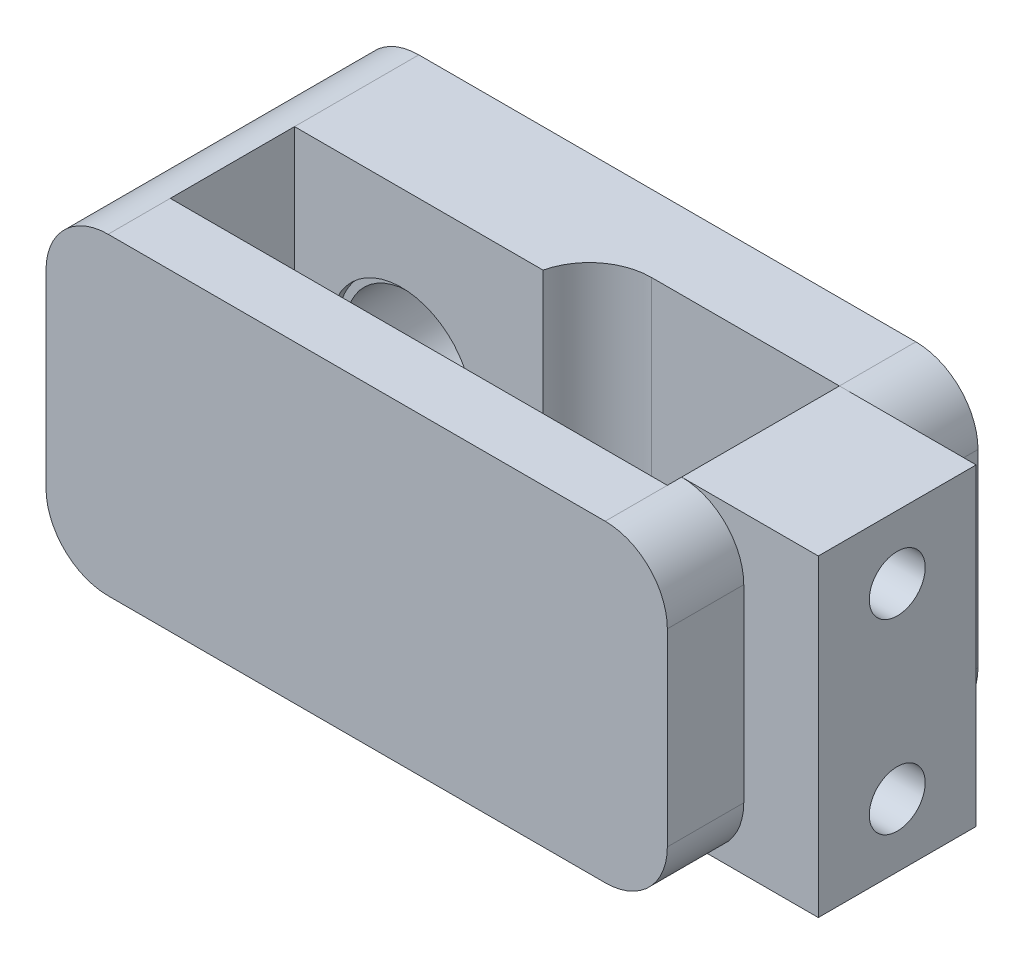
ISO-10303-21;
HEADER;
FILE_DESCRIPTION(('STEP AP214'),'2;1');
FILE_NAME('part.step','',(''),(''),'','','');
FILE_SCHEMA(('AUTOMOTIVE_DESIGN { 1 0 10303 214 1 1 1 1 }'));
ENDSEC;
DATA;
#1=APPLICATION_CONTEXT('core data for automotive mechanical design processes');
#2=APPLICATION_PROTOCOL_DEFINITION('international standard','automotive_design',2000,#1);
#3=PRODUCT_CONTEXT('',#1,'mechanical');
#4=PRODUCT('Part','Part','',(#3));
#5=PRODUCT_RELATED_PRODUCT_CATEGORY('part','',(#4));
#6=PRODUCT_DEFINITION_FORMATION('','',#4);
#7=PRODUCT_DEFINITION_CONTEXT('part definition',#1,'design');
#8=PRODUCT_DEFINITION('design','',#6,#7);
#9=PRODUCT_DEFINITION_SHAPE('','',#8);
#10=(LENGTH_UNIT() NAMED_UNIT(*) SI_UNIT(.MILLI.,.METRE.));
#11=(NAMED_UNIT(*) PLANE_ANGLE_UNIT() SI_UNIT($,.RADIAN.));
#12=(NAMED_UNIT(*) SI_UNIT($,.STERADIAN.) SOLID_ANGLE_UNIT());
#13=UNCERTAINTY_MEASURE_WITH_UNIT(LENGTH_MEASURE(1.E-05),#10,'distance_accuracy_value','');
#14=(GEOMETRIC_REPRESENTATION_CONTEXT(3) GLOBAL_UNCERTAINTY_ASSIGNED_CONTEXT((#13)) GLOBAL_UNIT_ASSIGNED_CONTEXT((#10,
#11,#12)) REPRESENTATION_CONTEXT('',''));
#15=CARTESIAN_POINT('',(0.,0.,0.));
#16=DIRECTION('',(0.,0.,1.));
#17=DIRECTION('',(1.,0.,0.));
#18=AXIS2_PLACEMENT_3D('',#15,#16,#17);
#19=CARTESIAN_POINT('',(0.,25.2,0.));
#20=DIRECTION('',(0.,1.,0.));
#21=DIRECTION('',(0.,0.,1.));
#22=AXIS2_PLACEMENT_3D('',#19,#20,#21);
#23=PLANE('',#22);
#24=DIRECTION('',(-1.,0.,0.));
#25=VECTOR('',#24,1.);
#26=CARTESIAN_POINT('',(20.,25.2,-6.35));
#27=LINE('',#26,#25);
#28=CARTESIAN_POINT('',(20.,25.2,-6.35));
#29=VERTEX_POINT('',#28);
#30=CARTESIAN_POINT('',(4.86595314404074,25.2,-6.35));
#31=VERTEX_POINT('',#30);
#32=EDGE_CURVE('E227',#29,#31,#27,.T.);
#33=ORIENTED_EDGE('',*,*,#32,.F.);
#34=DIRECTION('',(0.,0.,-1.));
#35=VECTOR('',#34,1.);
#36=CARTESIAN_POINT('',(20.,25.2,-12.5));
#37=LINE('',#36,#35);
#38=CARTESIAN_POINT('',(20.,25.2,-12.5));
#39=VERTEX_POINT('',#38);
#40=EDGE_CURVE('E325',#29,#39,#37,.T.);
#41=ORIENTED_EDGE('',*,*,#40,.T.);
#42=DIRECTION('',(-1.,0.,0.));
#43=VECTOR('',#42,1.);
#44=CARTESIAN_POINT('',(-25.,25.2,-12.5));
#45=LINE('',#44,#43);
#46=CARTESIAN_POINT('',(-20.,25.2,-12.5));
#47=VERTEX_POINT('',#46);
#48=EDGE_CURVE('E282',#39,#47,#45,.T.);
#49=ORIENTED_EDGE('',*,*,#48,.T.);
#50=DIRECTION('',(0.,0.,1.));
#51=VECTOR('',#50,1.);
#52=CARTESIAN_POINT('',(-20.,25.2,12.5));
#53=LINE('',#52,#51);
#54=CARTESIAN_POINT('',(-20.,25.2,-2.5));
#55=VERTEX_POINT('',#54);
#56=EDGE_CURVE('E320',#47,#55,#53,.T.);
#57=ORIENTED_EDGE('',*,*,#56,.T.);
#58=DIRECTION('',(-1.,0.,0.));
#59=VECTOR('',#58,1.);
#60=CARTESIAN_POINT('',(-20.,25.2,-2.5));
#61=LINE('',#60,#59);
#62=CARTESIAN_POINT('',(0.,25.2,-2.5));
#63=VERTEX_POINT('',#62);
#64=EDGE_CURVE('E250',#63,#55,#61,.T.);
#65=ORIENTED_EDGE('',*,*,#64,.F.);
#66=CARTESIAN_POINT('',(4.86595314404074,25.2,-1.35));
#67=DIRECTION('',(0.,1.,0.));
#68=DIRECTION('',(0.,0.,1.));
#69=AXIS2_PLACEMENT_3D('',#66,#67,#68);
#70=CIRCLE('',#69,5.);
#71=EDGE_CURVE('E47',#63,#31,#70,.F.);
#72=ORIENTED_EDGE('',*,*,#71,.T.);
#73=EDGE_LOOP('',(#33,#41,#49,#57,#65,#72));
#74=FACE_BOUND('',#73,.T.);
#75=ADVANCED_FACE('F39',(#74),#23,.T.);
#76=DIRECTION('',(1.,0.,0.));
#77=VECTOR('',#76,1.);
#78=CARTESIAN_POINT('',(-25.,25.2,12.5));
#79=LINE('',#78,#77);
#80=CARTESIAN_POINT('',(-20.,25.2,12.5));
#81=VERTEX_POINT('',#80);
#82=CARTESIAN_POINT('',(20.,25.2,12.5));
#83=VERTEX_POINT('',#82);
#84=EDGE_CURVE('E285',#81,#83,#79,.T.);
#85=ORIENTED_EDGE('',*,*,#84,.T.);
#86=DIRECTION('',(0.,0.,-1.));
#87=VECTOR('',#86,1.);
#88=CARTESIAN_POINT('',(20.,25.2,6.35));
#89=LINE('',#88,#87);
#90=CARTESIAN_POINT('',(20.,25.2,7.5));
#91=VERTEX_POINT('',#90);
#92=EDGE_CURVE('E322',#83,#91,#89,.T.);
#93=ORIENTED_EDGE('',*,*,#92,.T.);
#94=DIRECTION('',(1.,0.,0.));
#95=VECTOR('',#94,1.);
#96=CARTESIAN_POINT('',(-20.,25.2,7.5));
#97=LINE('',#96,#95);
#98=CARTESIAN_POINT('',(-20.,25.2,7.5));
#99=VERTEX_POINT('',#98);
#100=EDGE_CURVE('E278',#99,#91,#97,.T.);
#101=ORIENTED_EDGE('',*,*,#100,.F.);
#102=DIRECTION('',(0.,0.,1.));
#103=VECTOR('',#102,1.);
#104=CARTESIAN_POINT('',(-20.,25.2,12.5));
#105=LINE('',#104,#103);
#106=EDGE_CURVE('E198',#99,#81,#105,.T.);
#107=ORIENTED_EDGE('',*,*,#106,.T.);
#108=EDGE_LOOP('',(#85,#93,#101,#107));
#109=FACE_BOUND('',#108,.T.);
#110=ADVANCED_FACE('F378',(#109),#23,.T.);
#111=CARTESIAN_POINT('',(0.,0.,0.));
#112=DIRECTION('',(0.,1.,0.));
#113=DIRECTION('',(0.,0.,1.));
#114=AXIS2_PLACEMENT_3D('',#111,#112,#113);
#115=PLANE('',#114);
#116=DIRECTION('',(-1.,0.,0.));
#117=VECTOR('',#116,1.);
#118=CARTESIAN_POINT('',(-25.,0.,-12.5));
#119=LINE('',#118,#117);
#120=CARTESIAN_POINT('',(20.,0.,-12.5));
#121=VERTEX_POINT('',#120);
#122=CARTESIAN_POINT('',(-20.,0.,-12.5));
#123=VERTEX_POINT('',#122);
#124=EDGE_CURVE('E196',#121,#123,#119,.T.);
#125=ORIENTED_EDGE('',*,*,#124,.F.);
#126=DIRECTION('',(0.,0.,-1.));
#127=VECTOR('',#126,1.);
#128=CARTESIAN_POINT('',(20.,0.,0.));
#129=LINE('',#128,#127);
#130=CARTESIAN_POINT('',(20.,0.,-6.35));
#131=VERTEX_POINT('',#130);
#132=EDGE_CURVE('E190',#121,#131,#129,.F.);
#133=ORIENTED_EDGE('',*,*,#132,.T.);
#134=DIRECTION('',(-1.,0.,0.));
#135=VECTOR('',#134,1.);
#136=CARTESIAN_POINT('',(20.,0.,-6.35));
#137=LINE('',#136,#135);
#138=CARTESIAN_POINT('',(4.86595314404074,0.,-6.35));
#139=VERTEX_POINT('',#138);
#140=EDGE_CURVE('E193',#131,#139,#137,.T.);
#141=ORIENTED_EDGE('',*,*,#140,.T.);
#142=CARTESIAN_POINT('',(4.86595314404074,0.,-1.35));
#143=DIRECTION('',(0.,1.,0.));
#144=DIRECTION('',(0.,0.,1.));
#145=AXIS2_PLACEMENT_3D('',#142,#143,#144);
#146=CIRCLE('',#145,5.);
#147=CARTESIAN_POINT('',(0.,0.,-2.5));
#148=VERTEX_POINT('',#147);
#149=EDGE_CURVE('E11',#139,#148,#146,.T.);
#150=ORIENTED_EDGE('',*,*,#149,.T.);
#151=DIRECTION('',(-1.,0.,0.));
#152=VECTOR('',#151,1.);
#153=CARTESIAN_POINT('',(-20.,0.,-2.5));
#154=LINE('',#153,#152);
#155=CARTESIAN_POINT('',(-20.,0.,-2.5));
#156=VERTEX_POINT('',#155);
#157=EDGE_CURVE('E257',#148,#156,#154,.T.);
#158=ORIENTED_EDGE('',*,*,#157,.T.);
#159=DIRECTION('',(0.,0.,1.));
#160=VECTOR('',#159,1.);
#161=CARTESIAN_POINT('',(-20.,0.,0.));
#162=LINE('',#161,#160);
#163=EDGE_CURVE('E314',#156,#123,#162,.F.);
#164=ORIENTED_EDGE('',*,*,#163,.T.);
#165=EDGE_LOOP('',(#125,#133,#141,#150,#158,#164));
#166=FACE_BOUND('',#165,.T.);
#167=ADVANCED_FACE('F191',(#166),#115,.F.);
#168=DIRECTION('',(0.,0.,-1.));
#169=VECTOR('',#168,1.);
#170=CARTESIAN_POINT('',(20.,0.,-2.5));
#171=LINE('',#170,#169);
#172=CARTESIAN_POINT('',(20.,0.,6.35));
#173=VERTEX_POINT('',#172);
#174=EDGE_CURVE('E202',#173,#131,#171,.T.);
#175=ORIENTED_EDGE('',*,*,#174,.T.);
#176=DIRECTION('',(-1.,0.,0.));
#177=VECTOR('',#176,1.);
#178=CARTESIAN_POINT('',(31.,0.,-6.35));
#179=LINE('',#178,#177);
#180=CARTESIAN_POINT('',(31.,0.,-6.35));
#181=VERTEX_POINT('',#180);
#182=EDGE_CURVE('E172',#181,#131,#179,.T.);
#183=ORIENTED_EDGE('',*,*,#182,.F.);
#184=DIRECTION('',(0.,0.,-1.));
#185=VECTOR('',#184,1.);
#186=CARTESIAN_POINT('',(31.,0.,6.35));
#187=LINE('',#186,#185);
#188=CARTESIAN_POINT('',(31.,0.,6.35));
#189=VERTEX_POINT('',#188);
#190=EDGE_CURVE('E395',#189,#181,#187,.T.);
#191=ORIENTED_EDGE('',*,*,#190,.F.);
#192=DIRECTION('',(-1.,0.,0.));
#193=VECTOR('',#192,1.);
#194=CARTESIAN_POINT('',(31.,0.,6.35));
#195=LINE('',#194,#193);
#196=EDGE_CURVE('E183',#189,#173,#195,.T.);
#197=ORIENTED_EDGE('',*,*,#196,.T.);
#198=EDGE_LOOP('',(#175,#183,#191,#197));
#199=FACE_BOUND('',#198,.T.);
#200=ADVANCED_FACE('F204',(#199),#115,.F.);
#201=CARTESIAN_POINT('',(25.,25.2,-12.5));
#202=DIRECTION('',(-1.,0.,0.));
#203=DIRECTION('',(0.,0.,1.));
#204=AXIS2_PLACEMENT_3D('',#201,#202,#203);
#205=PLANE('',#204);
#206=DIRECTION('',(0.,-1.,0.));
#207=VECTOR('',#206,1.);
#208=CARTESIAN_POINT('',(25.,25.2,12.5));
#209=LINE('',#208,#207);
#210=CARTESIAN_POINT('',(25.,20.2,12.5));
#211=VERTEX_POINT('',#210);
#212=CARTESIAN_POINT('',(25.,5.,12.5));
#213=VERTEX_POINT('',#212);
#214=EDGE_CURVE('E289',#211,#213,#209,.T.);
#215=ORIENTED_EDGE('',*,*,#214,.T.);
#216=DIRECTION('',(0.,0.,-1.));
#217=VECTOR('',#216,1.);
#218=CARTESIAN_POINT('',(25.,5.,-12.5));
#219=LINE('',#218,#217);
#220=CARTESIAN_POINT('',(25.,5.,6.35));
#221=VERTEX_POINT('',#220);
#222=EDGE_CURVE('E329',#213,#221,#219,.T.);
#223=ORIENTED_EDGE('',*,*,#222,.T.);
#224=DIRECTION('',(0.,-1.,0.));
#225=VECTOR('',#224,1.);
#226=CARTESIAN_POINT('',(25.,25.2,6.35));
#227=LINE('',#226,#225);
#228=CARTESIAN_POINT('',(25.,20.2,6.35));
#229=VERTEX_POINT('',#228);
#230=EDGE_CURVE('E372',#229,#221,#227,.T.);
#231=ORIENTED_EDGE('',*,*,#230,.F.);
#232=DIRECTION('',(0.,0.,-1.));
#233=VECTOR('',#232,1.);
#234=CARTESIAN_POINT('',(25.,20.2,12.5));
#235=LINE('',#234,#233);
#236=EDGE_CURVE('E327',#229,#211,#235,.F.);
#237=ORIENTED_EDGE('',*,*,#236,.T.);
#238=EDGE_LOOP('',(#215,#223,#231,#237));
#239=FACE_BOUND('',#238,.T.);
#240=ADVANCED_FACE('F368',(#239),#205,.F.);
#241=DIRECTION('',(0.,1.,0.));
#242=VECTOR('',#241,1.);
#243=CARTESIAN_POINT('',(25.,25.2,-6.35));
#244=LINE('',#243,#242);
#245=CARTESIAN_POINT('',(25.,5.,-6.35));
#246=VERTEX_POINT('',#245);
#247=CARTESIAN_POINT('',(25.,20.2,-6.35));
#248=VERTEX_POINT('',#247);
#249=EDGE_CURVE('E390',#246,#248,#244,.T.);
#250=ORIENTED_EDGE('',*,*,#249,.F.);
#251=DIRECTION('',(0.,0.,-1.));
#252=VECTOR('',#251,1.);
#253=CARTESIAN_POINT('',(25.,5.,-12.5));
#254=LINE('',#253,#252);
#255=CARTESIAN_POINT('',(25.,5.,-12.5));
#256=VERTEX_POINT('',#255);
#257=EDGE_CURVE('E232',#246,#256,#254,.T.);
#258=ORIENTED_EDGE('',*,*,#257,.T.);
#259=DIRECTION('',(0.,-1.,0.));
#260=VECTOR('',#259,1.);
#261=CARTESIAN_POINT('',(25.,25.2,-12.5));
#262=LINE('',#261,#260);
#263=CARTESIAN_POINT('',(25.,20.2,-12.5));
#264=VERTEX_POINT('',#263);
#265=EDGE_CURVE('E300',#264,#256,#262,.T.);
#266=ORIENTED_EDGE('',*,*,#265,.F.);
#267=DIRECTION('',(0.,0.,-1.));
#268=VECTOR('',#267,1.);
#269=CARTESIAN_POINT('',(25.,20.2,-6.35));
#270=LINE('',#269,#268);
#271=EDGE_CURVE('E303',#264,#248,#270,.F.);
#272=ORIENTED_EDGE('',*,*,#271,.T.);
#273=EDGE_LOOP('',(#250,#258,#266,#272));
#274=FACE_BOUND('',#273,.T.);
#275=ADVANCED_FACE('F388',(#274),#205,.F.);
#276=DIRECTION('',(-1.,0.,0.));
#277=VECTOR('',#276,1.);
#278=CARTESIAN_POINT('',(31.,25.2,-6.35));
#279=LINE('',#278,#277);
#280=CARTESIAN_POINT('',(31.,25.2,-6.35));
#281=VERTEX_POINT('',#280);
#282=EDGE_CURVE('E184',#281,#29,#279,.T.);
#283=ORIENTED_EDGE('',*,*,#282,.T.);
#284=DIRECTION('',(0.,0.,-1.));
#285=VECTOR('',#284,1.);
#286=CARTESIAN_POINT('',(20.,25.2,-2.5));
#287=LINE('',#286,#285);
#288=CARTESIAN_POINT('',(20.,25.2,6.35));
#289=VERTEX_POINT('',#288);
#290=EDGE_CURVE('E218',#289,#29,#287,.T.);
#291=ORIENTED_EDGE('',*,*,#290,.F.);
#292=DIRECTION('',(-1.,0.,0.));
#293=VECTOR('',#292,1.);
#294=CARTESIAN_POINT('',(31.,25.2,6.35));
#295=LINE('',#294,#293);
#296=CARTESIAN_POINT('',(31.,25.2,6.35));
#297=VERTEX_POINT('',#296);
#298=EDGE_CURVE('E401',#297,#289,#295,.T.);
#299=ORIENTED_EDGE('',*,*,#298,.F.);
#300=DIRECTION('',(0.,0.,1.));
#301=VECTOR('',#300,1.);
#302=CARTESIAN_POINT('',(31.,25.2,6.35));
#303=LINE('',#302,#301);
#304=EDGE_CURVE('E403',#281,#297,#303,.T.);
#305=ORIENTED_EDGE('',*,*,#304,.F.);
#306=EDGE_LOOP('',(#283,#291,#299,#305));
#307=FACE_BOUND('',#306,.T.);
#308=ADVANCED_FACE('F452',(#307),#23,.T.);
#309=DIRECTION('',(1.,0.,0.));
#310=VECTOR('',#309,1.);
#311=CARTESIAN_POINT('',(-20.,0.,7.5));
#312=LINE('',#311,#310);
#313=CARTESIAN_POINT('',(-20.,0.,7.5));
#314=VERTEX_POINT('',#313);
#315=CARTESIAN_POINT('',(20.,0.,7.5));
#316=VERTEX_POINT('',#315);
#317=EDGE_CURVE('E268',#314,#316,#312,.T.);
#318=ORIENTED_EDGE('',*,*,#317,.T.);
#319=DIRECTION('',(0.,0.,-1.));
#320=VECTOR('',#319,1.);
#321=CARTESIAN_POINT('',(20.,0.,0.));
#322=LINE('',#321,#320);
#323=CARTESIAN_POINT('',(20.,0.,12.5));
#324=VERTEX_POINT('',#323);
#325=EDGE_CURVE('E199',#316,#324,#322,.F.);
#326=ORIENTED_EDGE('',*,*,#325,.T.);
#327=DIRECTION('',(1.,0.,0.));
#328=VECTOR('',#327,1.);
#329=CARTESIAN_POINT('',(-25.,0.,12.5));
#330=LINE('',#329,#328);
#331=CARTESIAN_POINT('',(-20.,0.,12.5));
#332=VERTEX_POINT('',#331);
#333=EDGE_CURVE('E286',#332,#324,#330,.T.);
#334=ORIENTED_EDGE('',*,*,#333,.F.);
#335=DIRECTION('',(0.,0.,1.));
#336=VECTOR('',#335,1.);
#337=CARTESIAN_POINT('',(-20.,0.,0.));
#338=LINE('',#337,#336);
#339=EDGE_CURVE('E316',#332,#314,#338,.F.);
#340=ORIENTED_EDGE('',*,*,#339,.T.);
#341=EDGE_LOOP('',(#318,#326,#334,#340));
#342=FACE_BOUND('',#341,.T.);
#343=ADVANCED_FACE('F348',(#342),#115,.F.);
#344=CARTESIAN_POINT('',(-25.,25.2,-12.5));
#345=DIRECTION('',(0.,0.,1.));
#346=DIRECTION('',(1.,0.,0.));
#347=AXIS2_PLACEMENT_3D('',#344,#345,#346);
#348=PLANE('',#347);
#349=CARTESIAN_POINT('',(-11.4,12.6,-12.5));
#350=DIRECTION('',(0.,0.,1.));
#351=DIRECTION('',(1.,0.,0.));
#352=AXIS2_PLACEMENT_3D('',#349,#350,#351);
#353=CIRCLE('',#352,5.10000000000001);
#354=CARTESIAN_POINT('',(-6.29999999999998,12.6,-12.5));
#355=VERTEX_POINT('',#354);
#356=EDGE_CURVE('E210',#355,#355,#353,.T.);
#357=ORIENTED_EDGE('',*,*,#356,.T.);
#358=EDGE_LOOP('',(#357));
#359=FACE_BOUND('',#358,.T.);
#360=ORIENTED_EDGE('',*,*,#265,.T.);
#361=CARTESIAN_POINT('',(20.,5.,-12.5));
#362=DIRECTION('',(0.,0.,1.));
#363=DIRECTION('',(1.,0.,0.));
#364=AXIS2_PLACEMENT_3D('',#361,#362,#363);
#365=CIRCLE('',#364,5.);
#366=EDGE_CURVE('E312',#256,#121,#365,.F.);
#367=ORIENTED_EDGE('',*,*,#366,.T.);
#368=ORIENTED_EDGE('',*,*,#124,.T.);
#369=CARTESIAN_POINT('',(-20.,5.,-12.5));
#370=DIRECTION('',(0.,0.,1.));
#371=DIRECTION('',(1.,0.,0.));
#372=AXIS2_PLACEMENT_3D('',#369,#370,#371);
#373=CIRCLE('',#372,5.);
#374=CARTESIAN_POINT('',(-25.,5.,-12.5));
#375=VERTEX_POINT('',#374);
#376=EDGE_CURVE('E308',#123,#375,#373,.F.);
#377=ORIENTED_EDGE('',*,*,#376,.T.);
#378=DIRECTION('',(0.,-1.,0.));
#379=VECTOR('',#378,1.);
#380=CARTESIAN_POINT('',(-25.,25.2,-12.5));
#381=LINE('',#380,#379);
#382=CARTESIAN_POINT('',(-25.,20.2,-12.5));
#383=VERTEX_POINT('',#382);
#384=EDGE_CURVE('E297',#383,#375,#381,.T.);
#385=ORIENTED_EDGE('',*,*,#384,.F.);
#386=CARTESIAN_POINT('',(-20.,20.2,-12.5));
#387=DIRECTION('',(0.,0.,1.));
#388=DIRECTION('',(1.,0.,0.));
#389=AXIS2_PLACEMENT_3D('',#386,#387,#388);
#390=CIRCLE('',#389,5.);
#391=EDGE_CURVE('E306',#383,#47,#390,.F.);
#392=ORIENTED_EDGE('',*,*,#391,.T.);
#393=ORIENTED_EDGE('',*,*,#48,.F.);
#394=CARTESIAN_POINT('',(20.,20.2,-12.5));
#395=DIRECTION('',(0.,0.,1.));
#396=DIRECTION('',(1.,0.,0.));
#397=AXIS2_PLACEMENT_3D('',#394,#395,#396);
#398=CIRCLE('',#397,5.);
#399=EDGE_CURVE('E310',#39,#264,#398,.F.);
#400=ORIENTED_EDGE('',*,*,#399,.T.);
#401=EDGE_LOOP('',(#360,#367,#368,#377,#385,#392,#393,#400));
#402=FACE_BOUND('',#401,.T.);
#403=ADVANCED_FACE('F384',(#359,#402),#348,.F.);
#404=CARTESIAN_POINT('',(-25.,25.2,-12.5));
#405=DIRECTION('',(1.,0.,0.));
#406=DIRECTION('',(0.,0.,-1.));
#407=AXIS2_PLACEMENT_3D('',#404,#405,#406);
#408=PLANE('',#407);
#409=ORIENTED_EDGE('',*,*,#384,.T.);
#410=DIRECTION('',(0.,0.,1.));
#411=VECTOR('',#410,1.);
#412=CARTESIAN_POINT('',(-25.,5.,-12.5));
#413=LINE('',#412,#411);
#414=CARTESIAN_POINT('',(-25.,5.,12.5));
#415=VERTEX_POINT('',#414);
#416=EDGE_CURVE('E238',#375,#415,#413,.T.);
#417=ORIENTED_EDGE('',*,*,#416,.T.);
#418=DIRECTION('',(0.,-1.,0.));
#419=VECTOR('',#418,1.);
#420=CARTESIAN_POINT('',(-25.,25.2,12.5));
#421=LINE('',#420,#419);
#422=CARTESIAN_POINT('',(-25.,20.2,12.5));
#423=VERTEX_POINT('',#422);
#424=EDGE_CURVE('E295',#423,#415,#421,.T.);
#425=ORIENTED_EDGE('',*,*,#424,.F.);
#426=DIRECTION('',(0.,0.,1.));
#427=VECTOR('',#426,1.);
#428=CARTESIAN_POINT('',(-25.,20.2,-12.5));
#429=LINE('',#428,#427);
#430=EDGE_CURVE('E338',#423,#383,#429,.F.);
#431=ORIENTED_EDGE('',*,*,#430,.T.);
#432=EDGE_LOOP('',(#409,#417,#425,#431));
#433=FACE_BOUND('',#432,.T.);
#434=ADVANCED_FACE('F340',(#433),#408,.F.);
#435=CARTESIAN_POINT('',(-25.,25.2,12.5));
#436=DIRECTION('',(0.,0.,-1.));
#437=DIRECTION('',(-1.,0.,0.));
#438=AXIS2_PLACEMENT_3D('',#435,#436,#437);
#439=PLANE('',#438);
#440=ORIENTED_EDGE('',*,*,#333,.T.);
#441=CARTESIAN_POINT('',(20.,5.,12.5));
#442=DIRECTION('',(0.,0.,-1.));
#443=DIRECTION('',(-1.,0.,0.));
#444=AXIS2_PLACEMENT_3D('',#441,#442,#443);
#445=CIRCLE('',#444,5.);
#446=EDGE_CURVE('E336',#324,#213,#445,.F.);
#447=ORIENTED_EDGE('',*,*,#446,.T.);
#448=ORIENTED_EDGE('',*,*,#214,.F.);
#449=CARTESIAN_POINT('',(20.,20.2,12.5));
#450=DIRECTION('',(0.,0.,-1.));
#451=DIRECTION('',(-1.,0.,0.));
#452=AXIS2_PLACEMENT_3D('',#449,#450,#451);
#453=CIRCLE('',#452,5.);
#454=EDGE_CURVE('E334',#211,#83,#453,.F.);
#455=ORIENTED_EDGE('',*,*,#454,.T.);
#456=ORIENTED_EDGE('',*,*,#84,.F.);
#457=CARTESIAN_POINT('',(-20.,20.2,12.5));
#458=DIRECTION('',(0.,0.,-1.));
#459=DIRECTION('',(-1.,0.,0.));
#460=AXIS2_PLACEMENT_3D('',#457,#458,#459);
#461=CIRCLE('',#460,5.);
#462=EDGE_CURVE('E62',#81,#423,#461,.F.);
#463=ORIENTED_EDGE('',*,*,#462,.T.);
#464=ORIENTED_EDGE('',*,*,#424,.T.);
#465=CARTESIAN_POINT('',(-20.,5.,12.5));
#466=DIRECTION('',(0.,0.,-1.));
#467=DIRECTION('',(-1.,0.,0.));
#468=AXIS2_PLACEMENT_3D('',#465,#466,#467);
#469=CIRCLE('',#468,5.);
#470=EDGE_CURVE('E54',#415,#332,#469,.F.);
#471=ORIENTED_EDGE('',*,*,#470,.T.);
#472=EDGE_LOOP('',(#440,#447,#448,#455,#456,#463,#464,#471));
#473=FACE_BOUND('',#472,.T.);
#474=ADVANCED_FACE('F344',(#473),#439,.F.);
#475=CARTESIAN_POINT('',(20.,25.2,-2.5));
#476=DIRECTION('',(-1.,0.,0.));
#477=DIRECTION('',(0.,0.,1.));
#478=AXIS2_PLACEMENT_3D('',#475,#476,#477);
#479=PLANE('',#478);
#480=CARTESIAN_POINT('',(20.,20.1,0.));
#481=DIRECTION('',(-1.,0.,0.));
#482=DIRECTION('',(0.,0.,1.));
#483=AXIS2_PLACEMENT_3D('',#480,#481,#482);
#484=CIRCLE('',#483,2.275);
#485=CARTESIAN_POINT('',(20.,20.1,2.27499999999996));
#486=VERTEX_POINT('',#485);
#487=EDGE_CURVE('E743',#486,#486,#484,.T.);
#488=ORIENTED_EDGE('',*,*,#487,.F.);
#489=EDGE_LOOP('',(#488));
#490=FACE_BOUND('',#489,.T.);
#491=CARTESIAN_POINT('',(20.,5.1,0.));
#492=DIRECTION('',(-1.,0.,0.));
#493=DIRECTION('',(0.,0.,1.));
#494=AXIS2_PLACEMENT_3D('',#491,#492,#493);
#495=CIRCLE('',#494,2.275);
#496=CARTESIAN_POINT('',(20.,5.1,2.27499999999996));
#497=VERTEX_POINT('',#496);
#498=EDGE_CURVE('E734',#497,#497,#495,.T.);
#499=ORIENTED_EDGE('',*,*,#498,.F.);
#500=EDGE_LOOP('',(#499));
#501=FACE_BOUND('',#500,.T.);
#502=EDGE_CURVE('E209',#316,#173,#171,.T.);
#503=ORIENTED_EDGE('',*,*,#502,.F.);
#504=DIRECTION('',(0.,-1.,0.));
#505=VECTOR('',#504,1.);
#506=CARTESIAN_POINT('',(20.,25.2,7.5));
#507=LINE('',#506,#505);
#508=EDGE_CURVE('E274',#91,#316,#507,.T.);
#509=ORIENTED_EDGE('',*,*,#508,.F.);
#510=EDGE_CURVE('E417',#91,#289,#287,.T.);
#511=ORIENTED_EDGE('',*,*,#510,.T.);
#512=ORIENTED_EDGE('',*,*,#290,.T.);
#513=DIRECTION('',(0.,1.,0.));
#514=VECTOR('',#513,1.);
#515=CARTESIAN_POINT('',(20.,0.,-6.35));
#516=LINE('',#515,#514);
#517=EDGE_CURVE('E214',#131,#29,#516,.T.);
#518=ORIENTED_EDGE('',*,*,#517,.F.);
#519=ORIENTED_EDGE('',*,*,#174,.F.);
#520=EDGE_LOOP('',(#503,#509,#511,#512,#518,#519));
#521=FACE_BOUND('',#520,.T.);
#522=ADVANCED_FACE('F215',(#490,#501,#521),#479,.T.);
#523=CARTESIAN_POINT('',(-20.,25.2,-2.5));
#524=DIRECTION('',(0.,0.,1.));
#525=DIRECTION('',(1.,0.,0.));
#526=AXIS2_PLACEMENT_3D('',#523,#524,#525);
#527=PLANE('',#526);
#528=DIRECTION('',(0.,1.,0.));
#529=VECTOR('',#528,1.);
#530=CARTESIAN_POINT('',(0.,0.,-2.5));
#531=LINE('',#530,#529);
#532=EDGE_CURVE('E222',#148,#63,#531,.T.);
#533=ORIENTED_EDGE('',*,*,#532,.T.);
#534=ORIENTED_EDGE('',*,*,#64,.T.);
#535=DIRECTION('',(0.,-1.,0.));
#536=VECTOR('',#535,1.);
#537=CARTESIAN_POINT('',(-20.,25.2,-2.5));
#538=LINE('',#537,#536);
#539=EDGE_CURVE('E263',#55,#156,#538,.T.);
#540=ORIENTED_EDGE('',*,*,#539,.T.);
#541=ORIENTED_EDGE('',*,*,#157,.F.);
#542=EDGE_LOOP('',(#533,#534,#540,#541));
#543=FACE_BOUND('',#542,.T.);
#544=CARTESIAN_POINT('',(-11.4,12.6,-2.5));
#545=DIRECTION('',(0.,0.,1.));
#546=DIRECTION('',(1.,0.,0.));
#547=AXIS2_PLACEMENT_3D('',#544,#545,#546);
#548=CIRCLE('',#547,5.70000000000001);
#549=CARTESIAN_POINT('',(-5.69999999999998,12.6,-2.5));
#550=VERTEX_POINT('',#549);
#551=EDGE_CURVE('E406',#550,#550,#548,.T.);
#552=ORIENTED_EDGE('',*,*,#551,.F.);
#553=EDGE_LOOP('',(#552));
#554=FACE_BOUND('',#553,.T.);
#555=ADVANCED_FACE('F260',(#543,#554),#527,.T.);
#556=CARTESIAN_POINT('',(-20.,25.2,-2.5));
#557=DIRECTION('',(1.,0.,0.));
#558=DIRECTION('',(0.,0.,-1.));
#559=AXIS2_PLACEMENT_3D('',#556,#557,#558);
#560=PLANE('',#559);
#561=DIRECTION('',(0.,0.,1.));
#562=VECTOR('',#561,1.);
#563=CARTESIAN_POINT('',(-20.,0.,-2.5));
#564=LINE('',#563,#562);
#565=EDGE_CURVE('E265',#156,#314,#564,.T.);
#566=ORIENTED_EDGE('',*,*,#565,.F.);
#567=ORIENTED_EDGE('',*,*,#539,.F.);
#568=DIRECTION('',(0.,0.,1.));
#569=VECTOR('',#568,1.);
#570=CARTESIAN_POINT('',(-20.,25.2,-2.5));
#571=LINE('',#570,#569);
#572=EDGE_CURVE('E356',#55,#99,#571,.T.);
#573=ORIENTED_EDGE('',*,*,#572,.T.);
#574=DIRECTION('',(0.,-1.,0.));
#575=VECTOR('',#574,1.);
#576=CARTESIAN_POINT('',(-20.,25.2,7.5));
#577=LINE('',#576,#575);
#578=EDGE_CURVE('E277',#99,#314,#577,.T.);
#579=ORIENTED_EDGE('',*,*,#578,.T.);
#580=EDGE_LOOP('',(#566,#567,#573,#579));
#581=FACE_BOUND('',#580,.T.);
#582=ADVANCED_FACE('F353',(#581),#560,.T.);
#583=CARTESIAN_POINT('',(-20.,25.2,7.5));
#584=DIRECTION('',(0.,0.,-1.));
#585=DIRECTION('',(-1.,0.,0.));
#586=AXIS2_PLACEMENT_3D('',#583,#584,#585);
#587=PLANE('',#586);
#588=ORIENTED_EDGE('',*,*,#317,.F.);
#589=ORIENTED_EDGE('',*,*,#578,.F.);
#590=ORIENTED_EDGE('',*,*,#100,.T.);
#591=ORIENTED_EDGE('',*,*,#508,.T.);
#592=EDGE_LOOP('',(#588,#589,#590,#591));
#593=FACE_BOUND('',#592,.T.);
#594=ADVANCED_FACE('F360',(#593),#587,.T.);
#595=CARTESIAN_POINT('',(-11.4,12.6,-2.5));
#596=DIRECTION('',(0.,0.,1.));
#597=DIRECTION('',(1.,0.,0.));
#598=AXIS2_PLACEMENT_3D('',#595,#596,#597);
#599=CYLINDRICAL_SURFACE('',#598,5.10000000000001);
#600=ORIENTED_EDGE('',*,*,#356,.F.);
#601=EDGE_LOOP('',(#600));
#602=FACE_BOUND('',#601,.T.);
#603=CARTESIAN_POINT('',(-11.4,12.6,-3.1));
#604=DIRECTION('',(0.,0.,1.));
#605=DIRECTION('',(1.,0.,0.));
#606=AXIS2_PLACEMENT_3D('',#603,#604,#605);
#607=CIRCLE('',#606,5.10000000000001);
#608=CARTESIAN_POINT('',(-6.29999999999998,12.6,-3.1));
#609=VERTEX_POINT('',#608);
#610=EDGE_CURVE('E412',#609,#609,#607,.T.);
#611=ORIENTED_EDGE('',*,*,#610,.T.);
#612=EDGE_LOOP('',(#611));
#613=FACE_BOUND('',#612,.T.);
#614=ADVANCED_FACE('F423',(#602,#613),#599,.F.);
#615=CARTESIAN_POINT('',(-6.29999999999998,12.6,-3.1));
#616=DIRECTION('',(0.,0.,-1.));
#617=DIRECTION('',(-1.,0.,0.));
#618=AXIS2_PLACEMENT_3D('',#615,#616,#617);
#619=PLANE('',#618);
#620=ORIENTED_EDGE('',*,*,#610,.F.);
#621=EDGE_LOOP('',(#620));
#622=FACE_BOUND('',#621,.T.);
#623=CARTESIAN_POINT('',(-11.4,12.6,-3.1));
#624=DIRECTION('',(0.,0.,1.));
#625=DIRECTION('',(1.,0.,0.));
#626=AXIS2_PLACEMENT_3D('',#623,#624,#625);
#627=CIRCLE('',#626,5.70000000000001);
#628=CARTESIAN_POINT('',(-5.69999999999998,12.6,-3.1));
#629=VERTEX_POINT('',#628);
#630=EDGE_CURVE('E409',#629,#629,#627,.T.);
#631=ORIENTED_EDGE('',*,*,#630,.T.);
#632=EDGE_LOOP('',(#631));
#633=FACE_BOUND('',#632,.T.);
#634=ADVANCED_FACE('F426',(#622,#633),#619,.F.);
#635=CARTESIAN_POINT('',(-11.4,12.6,-2.5));
#636=DIRECTION('',(0.,0.,1.));
#637=DIRECTION('',(1.,0.,0.));
#638=AXIS2_PLACEMENT_3D('',#635,#636,#637);
#639=CYLINDRICAL_SURFACE('',#638,5.70000000000001);
#640=ORIENTED_EDGE('',*,*,#630,.F.);
#641=EDGE_LOOP('',(#640));
#642=FACE_BOUND('',#641,.T.);
#643=ORIENTED_EDGE('',*,*,#551,.T.);
#644=EDGE_LOOP('',(#643));
#645=FACE_BOUND('',#644,.T.);
#646=ADVANCED_FACE('F432',(#642,#645),#639,.F.);
#647=CARTESIAN_POINT('',(31.,25.2,6.35));
#648=DIRECTION('',(0.,0.,-1.));
#649=DIRECTION('',(0.,1.,0.));
#650=AXIS2_PLACEMENT_3D('',#647,#648,#649);
#651=PLANE('',#650);
#652=ORIENTED_EDGE('',*,*,#298,.T.);
#653=CARTESIAN_POINT('',(20.,20.2,6.35));
#654=DIRECTION('',(0.,0.,-1.));
#655=DIRECTION('',(0.,1.,0.));
#656=AXIS2_PLACEMENT_3D('',#653,#654,#655);
#657=CIRCLE('',#656,5.);
#658=EDGE_CURVE('E243',#289,#229,#657,.T.);
#659=ORIENTED_EDGE('',*,*,#658,.T.);
#660=ORIENTED_EDGE('',*,*,#230,.T.);
#661=CARTESIAN_POINT('',(20.,5.,6.35));
#662=DIRECTION('',(0.,0.,-1.));
#663=DIRECTION('',(0.,1.,0.));
#664=AXIS2_PLACEMENT_3D('',#661,#662,#663);
#665=CIRCLE('',#664,5.);
#666=EDGE_CURVE('E236',#221,#173,#665,.T.);
#667=ORIENTED_EDGE('',*,*,#666,.T.);
#668=ORIENTED_EDGE('',*,*,#196,.F.);
#669=DIRECTION('',(0.,-1.,0.));
#670=VECTOR('',#669,1.);
#671=CARTESIAN_POINT('',(31.,25.2,6.35));
#672=LINE('',#671,#670);
#673=EDGE_CURVE('E392',#297,#189,#672,.T.);
#674=ORIENTED_EDGE('',*,*,#673,.F.);
#675=EDGE_LOOP('',(#652,#659,#660,#667,#668,#674));
#676=FACE_BOUND('',#675,.T.);
#677=ADVANCED_FACE('F438',(#676),#651,.F.);
#678=CARTESIAN_POINT('',(31.,25.2,-6.35));
#679=DIRECTION('',(0.,0.,1.));
#680=DIRECTION('',(0.,-1.,0.));
#681=AXIS2_PLACEMENT_3D('',#678,#679,#680);
#682=PLANE('',#681);
#683=ORIENTED_EDGE('',*,*,#182,.T.);
#684=CARTESIAN_POINT('',(20.,5.,-6.35));
#685=DIRECTION('',(0.,0.,1.));
#686=DIRECTION('',(0.,-1.,0.));
#687=AXIS2_PLACEMENT_3D('',#684,#685,#686);
#688=CIRCLE('',#687,5.);
#689=EDGE_CURVE('E177',#131,#246,#688,.T.);
#690=ORIENTED_EDGE('',*,*,#689,.T.);
#691=ORIENTED_EDGE('',*,*,#249,.T.);
#692=CARTESIAN_POINT('',(20.,20.2,-6.35));
#693=DIRECTION('',(0.,0.,1.));
#694=DIRECTION('',(0.,-1.,0.));
#695=AXIS2_PLACEMENT_3D('',#692,#693,#694);
#696=CIRCLE('',#695,5.);
#697=EDGE_CURVE('E233',#248,#29,#696,.T.);
#698=ORIENTED_EDGE('',*,*,#697,.T.);
#699=ORIENTED_EDGE('',*,*,#282,.F.);
#700=DIRECTION('',(0.,1.,0.));
#701=VECTOR('',#700,1.);
#702=CARTESIAN_POINT('',(31.,25.2,-6.35));
#703=LINE('',#702,#701);
#704=EDGE_CURVE('E180',#181,#281,#703,.T.);
#705=ORIENTED_EDGE('',*,*,#704,.F.);
#706=EDGE_LOOP('',(#683,#690,#691,#698,#699,#705));
#707=FACE_BOUND('',#706,.T.);
#708=ADVANCED_FACE('F174',(#707),#682,.F.);
#709=CARTESIAN_POINT('',(31.,0.,0.));
#710=DIRECTION('',(1.,0.,0.));
#711=DIRECTION('',(0.,0.,-1.));
#712=AXIS2_PLACEMENT_3D('',#709,#710,#711);
#713=PLANE('',#712);
#714=CARTESIAN_POINT('',(31.,20.1,0.));
#715=DIRECTION('',(-1.,0.,0.));
#716=DIRECTION('',(0.,0.,1.));
#717=AXIS2_PLACEMENT_3D('',#714,#715,#716);
#718=CIRCLE('',#717,2.25);
#719=CARTESIAN_POINT('',(31.,20.1,2.24999999999996));
#720=VERTEX_POINT('',#719);
#721=EDGE_CURVE('E737',#720,#720,#718,.T.);
#722=ORIENTED_EDGE('',*,*,#721,.T.);
#723=EDGE_LOOP('',(#722));
#724=FACE_BOUND('',#723,.T.);
#725=CARTESIAN_POINT('',(31.,5.1,0.));
#726=DIRECTION('',(-1.,0.,0.));
#727=DIRECTION('',(0.,0.,1.));
#728=AXIS2_PLACEMENT_3D('',#725,#726,#727);
#729=CIRCLE('',#728,2.25);
#730=CARTESIAN_POINT('',(31.,5.1,2.24999999999996));
#731=VERTEX_POINT('',#730);
#732=EDGE_CURVE('E397',#731,#731,#729,.T.);
#733=ORIENTED_EDGE('',*,*,#732,.T.);
#734=EDGE_LOOP('',(#733));
#735=FACE_BOUND('',#734,.T.);
#736=ORIENTED_EDGE('',*,*,#673,.T.);
#737=ORIENTED_EDGE('',*,*,#190,.T.);
#738=ORIENTED_EDGE('',*,*,#704,.T.);
#739=ORIENTED_EDGE('',*,*,#304,.T.);
#740=EDGE_LOOP('',(#736,#737,#738,#739));
#741=FACE_BOUND('',#740,.T.);
#742=ADVANCED_FACE('F593',(#724,#735,#741),#713,.T.);
#743=CARTESIAN_POINT('',(20.,5.1,0.));
#744=DIRECTION('',(-1.,0.,0.));
#745=DIRECTION('',(0.,0.,1.));
#746=AXIS2_PLACEMENT_3D('',#743,#744,#745);
#747=CYLINDRICAL_SURFACE('',#746,2.25);
#748=ORIENTED_EDGE('',*,*,#732,.F.);
#749=EDGE_LOOP('',(#748));
#750=FACE_BOUND('',#749,.T.);
#751=CARTESIAN_POINT('',(20.025,5.1,0.));
#752=DIRECTION('',(-1.,0.,0.));
#753=DIRECTION('',(0.,0.,1.));
#754=AXIS2_PLACEMENT_3D('',#751,#752,#753);
#755=CIRCLE('',#754,2.25);
#756=CARTESIAN_POINT('',(20.025,5.1,2.24999999999996));
#757=VERTEX_POINT('',#756);
#758=EDGE_CURVE('E731',#757,#757,#755,.T.);
#759=ORIENTED_EDGE('',*,*,#758,.T.);
#760=EDGE_LOOP('',(#759));
#761=FACE_BOUND('',#760,.T.);
#762=ADVANCED_FACE('F584',(#750,#761),#747,.F.);
#763=CARTESIAN_POINT('',(20.,5.1,0.));
#764=DIRECTION('',(-1.,0.,0.));
#765=DIRECTION('',(0.,0.,1.));
#766=AXIS2_PLACEMENT_3D('',#763,#764,#765);
#767=CONICAL_SURFACE('',#766,2.275,0.785398163397466);
#768=ORIENTED_EDGE('',*,*,#758,.F.);
#769=EDGE_LOOP('',(#768));
#770=FACE_BOUND('',#769,.T.);
#771=ORIENTED_EDGE('',*,*,#498,.T.);
#772=EDGE_LOOP('',(#771));
#773=FACE_BOUND('',#772,.T.);
#774=ADVANCED_FACE('F575',(#770,#773),#767,.F.);
#775=CARTESIAN_POINT('',(20.,20.1,0.));
#776=DIRECTION('',(-1.,0.,0.));
#777=DIRECTION('',(0.,0.,1.));
#778=AXIS2_PLACEMENT_3D('',#775,#776,#777);
#779=CYLINDRICAL_SURFACE('',#778,2.25);
#780=ORIENTED_EDGE('',*,*,#721,.F.);
#781=EDGE_LOOP('',(#780));
#782=FACE_BOUND('',#781,.T.);
#783=CARTESIAN_POINT('',(20.025,20.1,0.));
#784=DIRECTION('',(-1.,0.,0.));
#785=DIRECTION('',(0.,0.,1.));
#786=AXIS2_PLACEMENT_3D('',#783,#784,#785);
#787=CIRCLE('',#786,2.25);
#788=CARTESIAN_POINT('',(20.025,20.1,2.24999999999996));
#789=VERTEX_POINT('',#788);
#790=EDGE_CURVE('E740',#789,#789,#787,.T.);
#791=ORIENTED_EDGE('',*,*,#790,.T.);
#792=EDGE_LOOP('',(#791));
#793=FACE_BOUND('',#792,.T.);
#794=ADVANCED_FACE('F566',(#782,#793),#779,.F.);
#795=CARTESIAN_POINT('',(20.,20.1,0.));
#796=DIRECTION('',(-1.,0.,0.));
#797=DIRECTION('',(0.,0.,1.));
#798=AXIS2_PLACEMENT_3D('',#795,#796,#797);
#799=CONICAL_SURFACE('',#798,2.275,0.785398163397448);
#800=ORIENTED_EDGE('',*,*,#790,.F.);
#801=EDGE_LOOP('',(#800));
#802=FACE_BOUND('',#801,.T.);
#803=ORIENTED_EDGE('',*,*,#487,.T.);
#804=EDGE_LOOP('',(#803));
#805=FACE_BOUND('',#804,.T.);
#806=ADVANCED_FACE('F558',(#802,#805),#799,.F.);
#807=CARTESIAN_POINT('',(20.,0.,-6.35));
#808=DIRECTION('',(0.,0.,-1.));
#809=DIRECTION('',(-1.,0.,0.));
#810=AXIS2_PLACEMENT_3D('',#807,#808,#809);
#811=PLANE('',#810);
#812=ORIENTED_EDGE('',*,*,#32,.T.);
#813=DIRECTION('',(0.,1.,0.));
#814=VECTOR('',#813,1.);
#815=CARTESIAN_POINT('',(4.86595314404074,0.,-6.35));
#816=LINE('',#815,#814);
#817=EDGE_CURVE('E226',#31,#139,#816,.F.);
#818=ORIENTED_EDGE('',*,*,#817,.T.);
#819=ORIENTED_EDGE('',*,*,#140,.F.);
#820=ORIENTED_EDGE('',*,*,#517,.T.);
#821=EDGE_LOOP('',(#812,#818,#819,#820));
#822=FACE_BOUND('',#821,.T.);
#823=ADVANCED_FACE('F224',(#822),#811,.F.);
#824=CARTESIAN_POINT('',(20.,5.,-12.5));
#825=DIRECTION('',(0.,0.,-1.));
#826=DIRECTION('',(-1.,0.,0.));
#827=AXIS2_PLACEMENT_3D('',#824,#825,#826);
#828=CYLINDRICAL_SURFACE('',#827,5.);
#829=ORIENTED_EDGE('',*,*,#689,.F.);
#830=ORIENTED_EDGE('',*,*,#132,.F.);
#831=ORIENTED_EDGE('',*,*,#366,.F.);
#832=ORIENTED_EDGE('',*,*,#257,.F.);
#833=EDGE_LOOP('',(#829,#830,#831,#832));
#834=FACE_BOUND('',#833,.T.);
#835=ADVANCED_FACE('F230',(#834),#828,.T.);
#836=CARTESIAN_POINT('',(20.,20.2,0.));
#837=DIRECTION('',(0.,0.,1.));
#838=DIRECTION('',(1.,0.,0.));
#839=AXIS2_PLACEMENT_3D('',#836,#837,#838);
#840=CYLINDRICAL_SURFACE('',#839,5.);
#841=ORIENTED_EDGE('',*,*,#697,.F.);
#842=ORIENTED_EDGE('',*,*,#271,.F.);
#843=ORIENTED_EDGE('',*,*,#399,.F.);
#844=ORIENTED_EDGE('',*,*,#40,.F.);
#845=EDGE_LOOP('',(#841,#842,#843,#844));
#846=FACE_BOUND('',#845,.T.);
#847=ADVANCED_FACE('F468',(#846),#840,.T.);
#848=CARTESIAN_POINT('',(20.,5.,-12.5));
#849=DIRECTION('',(0.,0.,-1.));
#850=DIRECTION('',(-1.,0.,0.));
#851=AXIS2_PLACEMENT_3D('',#848,#849,#850);
#852=CYLINDRICAL_SURFACE('',#851,5.);
#853=ORIENTED_EDGE('',*,*,#325,.F.);
#854=ORIENTED_EDGE('',*,*,#502,.T.);
#855=ORIENTED_EDGE('',*,*,#666,.F.);
#856=ORIENTED_EDGE('',*,*,#222,.F.);
#857=ORIENTED_EDGE('',*,*,#446,.F.);
#858=EDGE_LOOP('',(#853,#854,#855,#856,#857));
#859=FACE_BOUND('',#858,.T.);
#860=ADVANCED_FACE('F363',(#859),#852,.T.);
#861=CARTESIAN_POINT('',(20.,20.2,0.));
#862=DIRECTION('',(0.,0.,1.));
#863=DIRECTION('',(1.,0.,0.));
#864=AXIS2_PLACEMENT_3D('',#861,#862,#863);
#865=CYLINDRICAL_SURFACE('',#864,5.);
#866=ORIENTED_EDGE('',*,*,#454,.F.);
#867=ORIENTED_EDGE('',*,*,#236,.F.);
#868=ORIENTED_EDGE('',*,*,#658,.F.);
#869=ORIENTED_EDGE('',*,*,#510,.F.);
#870=ORIENTED_EDGE('',*,*,#92,.F.);
#871=EDGE_LOOP('',(#866,#867,#868,#869,#870));
#872=FACE_BOUND('',#871,.T.);
#873=ADVANCED_FACE('F375',(#872),#865,.T.);
#874=CARTESIAN_POINT('',(-20.,5.,-12.5));
#875=DIRECTION('',(0.,0.,1.));
#876=DIRECTION('',(1.,0.,0.));
#877=AXIS2_PLACEMENT_3D('',#874,#875,#876);
#878=CYLINDRICAL_SURFACE('',#877,5.);
#879=ORIENTED_EDGE('',*,*,#565,.T.);
#880=ORIENTED_EDGE('',*,*,#339,.F.);
#881=ORIENTED_EDGE('',*,*,#470,.F.);
#882=ORIENTED_EDGE('',*,*,#416,.F.);
#883=ORIENTED_EDGE('',*,*,#376,.F.);
#884=ORIENTED_EDGE('',*,*,#163,.F.);
#885=EDGE_LOOP('',(#879,#880,#881,#882,#883,#884));
#886=FACE_BOUND('',#885,.T.);
#887=ADVANCED_FACE('F350',(#886),#878,.T.);
#888=CARTESIAN_POINT('',(4.86595314404074,0.,-1.35));
#889=DIRECTION('',(0.,1.,0.));
#890=DIRECTION('',(0.,0.,1.));
#891=AXIS2_PLACEMENT_3D('',#888,#889,#890);
#892=CYLINDRICAL_SURFACE('',#891,5.);
#893=ORIENTED_EDGE('',*,*,#149,.F.);
#894=ORIENTED_EDGE('',*,*,#817,.F.);
#895=ORIENTED_EDGE('',*,*,#71,.F.);
#896=ORIENTED_EDGE('',*,*,#532,.F.);
#897=EDGE_LOOP('',(#893,#894,#895,#896));
#898=FACE_BOUND('',#897,.T.);
#899=ADVANCED_FACE('F255',(#898),#892,.F.);
#900=CARTESIAN_POINT('',(-20.,20.2,0.));
#901=DIRECTION('',(0.,0.,-1.));
#902=DIRECTION('',(-1.,0.,0.));
#903=AXIS2_PLACEMENT_3D('',#900,#901,#902);
#904=CYLINDRICAL_SURFACE('',#903,5.);
#905=ORIENTED_EDGE('',*,*,#391,.F.);
#906=ORIENTED_EDGE('',*,*,#430,.F.);
#907=ORIENTED_EDGE('',*,*,#462,.F.);
#908=ORIENTED_EDGE('',*,*,#106,.F.);
#909=ORIENTED_EDGE('',*,*,#572,.F.);
#910=ORIENTED_EDGE('',*,*,#56,.F.);
#911=EDGE_LOOP('',(#905,#906,#907,#908,#909,#910));
#912=FACE_BOUND('',#911,.T.);
#913=ADVANCED_FACE('F41',(#912),#904,.T.);
#914=CLOSED_SHELL('',(#75,#110,#167,#200,#240,#275,#308,#343,#403,#434,#474,#522,#555,#582,#594,
#614,#634,#646,#677,#708,#742,#762,#774,#794,#806,#823,#835,#847,#860,#873,#887,#899,#913));
#915=MANIFOLD_SOLID_BREP('B2',#914);
#916=ADVANCED_BREP_SHAPE_REPRESENTATION('',(#18,#915),#14);
#917=SHAPE_DEFINITION_REPRESENTATION(#9,#916);
ENDSEC;
END-ISO-10303-21;
